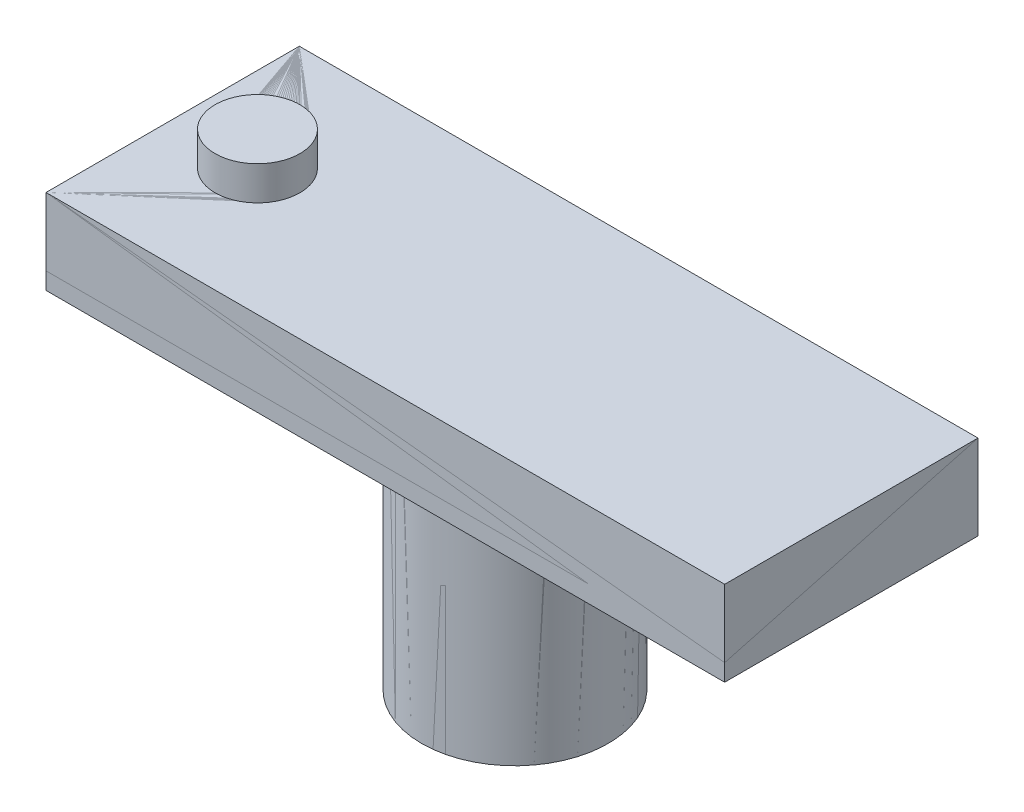
ISO-10303-21;
HEADER;
FILE_DESCRIPTION(('STEP AP214'),'2;1');
FILE_NAME('part.step','',(''),(''),'','','');
FILE_SCHEMA(('AUTOMOTIVE_DESIGN { 1 0 10303 214 1 1 1 1 }'));
ENDSEC;
DATA;
#1=APPLICATION_CONTEXT('core data for automotive mechanical design processes');
#2=APPLICATION_PROTOCOL_DEFINITION('international standard','automotive_design',2000,#1);
#3=PRODUCT_CONTEXT('',#1,'mechanical');
#4=PRODUCT('Part','Part','',(#3));
#5=PRODUCT_RELATED_PRODUCT_CATEGORY('part','',(#4));
#6=PRODUCT_DEFINITION_FORMATION('','',#4);
#7=PRODUCT_DEFINITION_CONTEXT('part definition',#1,'design');
#8=PRODUCT_DEFINITION('design','',#6,#7);
#9=PRODUCT_DEFINITION_SHAPE('','',#8);
#10=(LENGTH_UNIT() NAMED_UNIT(*) SI_UNIT(.MILLI.,.METRE.));
#11=(NAMED_UNIT(*) PLANE_ANGLE_UNIT() SI_UNIT($,.RADIAN.));
#12=(NAMED_UNIT(*) SI_UNIT($,.STERADIAN.) SOLID_ANGLE_UNIT());
#13=UNCERTAINTY_MEASURE_WITH_UNIT(LENGTH_MEASURE(1.E-05),#10,'distance_accuracy_value','');
#14=(GEOMETRIC_REPRESENTATION_CONTEXT(3) GLOBAL_UNCERTAINTY_ASSIGNED_CONTEXT((#13)) GLOBAL_UNIT_ASSIGNED_CONTEXT((#10,
#11,#12)) REPRESENTATION_CONTEXT('',''));
#15=CARTESIAN_POINT('',(0.,0.,0.));
#16=DIRECTION('',(0.,0.,1.));
#17=DIRECTION('',(1.,0.,0.));
#18=AXIS2_PLACEMENT_3D('',#15,#16,#17);
#19=CARTESIAN_POINT('',(0.196069676803745,0.,0.0239463278717267));
#20=DIRECTION('',(0.,1.,0.));
#21=DIRECTION('',(0.,0.,1.));
#22=AXIS2_PLACEMENT_3D('',#19,#20,#21);
#23=PLANE('',#22);
#24=CARTESIAN_POINT('',(0.196069676803745,0.,0.0239463278717267));
#25=DIRECTION('',(0.,1.,0.));
#26=DIRECTION('',(0.,0.,1.));
#27=AXIS2_PLACEMENT_3D('',#24,#25,#26);
#28=CIRCLE('',#27,5.5);
#29=CARTESIAN_POINT('',(0.196069676803745,0.,5.52394632787173));
#30=VERTEX_POINT('',#29);
#31=EDGE_CURVE('E152',#30,#30,#28,.T.);
#32=ORIENTED_EDGE('',*,*,#31,.F.);
#33=EDGE_LOOP('',(#32));
#34=FACE_BOUND('',#33,.T.);
#35=CARTESIAN_POINT('',(0.,0.,0.));
#36=DIRECTION('',(0.,1.,0.));
#37=DIRECTION('',(0.,0.,1.));
#38=AXIS2_PLACEMENT_3D('',#35,#36,#37);
#39=CIRCLE('',#38,4.);
#40=CARTESIAN_POINT('',(0.,0.,4.));
#41=VERTEX_POINT('',#40);
#42=EDGE_CURVE('E148',#41,#41,#39,.T.);
#43=ORIENTED_EDGE('',*,*,#42,.T.);
#44=EDGE_LOOP('',(#43));
#45=FACE_BOUND('',#44,.T.);
#46=ADVANCED_FACE('F51',(#34,#45),#23,.F.);
#47=CARTESIAN_POINT('',(0.196069676803745,15.,0.0239463278717267));
#48=DIRECTION('',(0.,-1.,0.));
#49=DIRECTION('',(0.,0.,-1.));
#50=AXIS2_PLACEMENT_3D('',#47,#48,#49);
#51=CYLINDRICAL_SURFACE('',#50,5.5);
#52=CARTESIAN_POINT('',(0.196069676803745,15.,0.0239463278717267));
#53=DIRECTION('',(0.,1.,0.));
#54=DIRECTION('',(0.,0.,1.));
#55=AXIS2_PLACEMENT_3D('',#52,#53,#54);
#56=CIRCLE('',#55,5.5);
#57=CARTESIAN_POINT('',(0.196069676803745,15.,5.52394632787173));
#58=VERTEX_POINT('',#57);
#59=EDGE_CURVE('E62',#58,#58,#56,.T.);
#60=ORIENTED_EDGE('',*,*,#59,.F.);
#61=EDGE_LOOP('',(#60));
#62=FACE_BOUND('',#61,.T.);
#63=ORIENTED_EDGE('',*,*,#31,.T.);
#64=EDGE_LOOP('',(#63));
#65=FACE_BOUND('',#64,.T.);
#66=ADVANCED_FACE('F53',(#62,#65),#51,.T.);
#67=CARTESIAN_POINT('',(0.,15.,0.));
#68=DIRECTION('',(0.,-1.,0.));
#69=DIRECTION('',(0.,0.,-1.));
#70=AXIS2_PLACEMENT_3D('',#67,#68,#69);
#71=CYLINDRICAL_SURFACE('',#70,4.);
#72=CARTESIAN_POINT('',(0.,15.,0.));
#73=DIRECTION('',(0.,1.,0.));
#74=DIRECTION('',(0.,0.,1.));
#75=AXIS2_PLACEMENT_3D('',#72,#73,#74);
#76=CIRCLE('',#75,4.);
#77=CARTESIAN_POINT('',(0.,15.,4.));
#78=VERTEX_POINT('',#77);
#79=EDGE_CURVE('E144',#78,#78,#76,.T.);
#80=ORIENTED_EDGE('',*,*,#79,.T.);
#81=EDGE_LOOP('',(#80));
#82=FACE_BOUND('',#81,.T.);
#83=ORIENTED_EDGE('',*,*,#42,.F.);
#84=EDGE_LOOP('',(#83));
#85=FACE_BOUND('',#84,.T.);
#86=ADVANCED_FACE('F164',(#82,#85),#71,.F.);
#87=CARTESIAN_POINT('',(0.,15.,0.));
#88=DIRECTION('',(0.,1.,0.));
#89=DIRECTION('',(0.,0.,1.));
#90=AXIS2_PLACEMENT_3D('',#87,#88,#89);
#91=PLANE('',#90);
#92=ORIENTED_EDGE('',*,*,#79,.F.);
#93=EDGE_LOOP('',(#92));
#94=FACE_BOUND('',#93,.T.);
#95=ADVANCED_FACE('F166',(#94),#91,.F.);
#96=CARTESIAN_POINT('',(-20.,19.,-7.46538735620483));
#97=DIRECTION('',(1.,0.,0.));
#98=DIRECTION('',(0.,0.,-1.));
#99=AXIS2_PLACEMENT_3D('',#96,#97,#98);
#100=PLANE('',#99);
#101=DIRECTION('',(0.,0.,1.));
#102=VECTOR('',#101,1.);
#103=CARTESIAN_POINT('',(-20.,15.,-7.46538735620483));
#104=LINE('',#103,#102);
#105=CARTESIAN_POINT('',(-20.,15.,-7.46538735620483));
#106=VERTEX_POINT('',#105);
#107=CARTESIAN_POINT('',(-20.,15.,7.46538735620483));
#108=VERTEX_POINT('',#107);
#109=EDGE_CURVE('E126',#106,#108,#104,.T.);
#110=ORIENTED_EDGE('',*,*,#109,.T.);
#111=DIRECTION('',(0.,-1.,0.));
#112=VECTOR('',#111,1.);
#113=CARTESIAN_POINT('',(-20.,19.,7.46538735620483));
#114=LINE('',#113,#112);
#115=CARTESIAN_POINT('',(-20.,19.,7.46538735620483));
#116=VERTEX_POINT('',#115);
#117=EDGE_CURVE('E116',#116,#108,#114,.T.);
#118=ORIENTED_EDGE('',*,*,#117,.F.);
#119=DIRECTION('',(0.,0.,1.));
#120=VECTOR('',#119,1.);
#121=CARTESIAN_POINT('',(-20.,19.,-7.46538735620483));
#122=LINE('',#121,#120);
#123=CARTESIAN_POINT('',(-20.,19.,-7.46538735620483));
#124=VERTEX_POINT('',#123);
#125=EDGE_CURVE('E105',#124,#116,#122,.T.);
#126=ORIENTED_EDGE('',*,*,#125,.F.);
#127=DIRECTION('',(0.,-1.,0.));
#128=VECTOR('',#127,1.);
#129=CARTESIAN_POINT('',(-20.,19.,-7.46538735620483));
#130=LINE('',#129,#128);
#131=EDGE_CURVE('E71',#124,#106,#130,.T.);
#132=ORIENTED_EDGE('',*,*,#131,.T.);
#133=EDGE_LOOP('',(#110,#118,#126,#132));
#134=FACE_BOUND('',#133,.T.);
#135=ADVANCED_FACE('F173',(#134),#100,.F.);
#136=CARTESIAN_POINT('',(-20.,19.,7.46538735620483));
#137=DIRECTION('',(0.,0.,-1.));
#138=DIRECTION('',(-1.,0.,0.));
#139=AXIS2_PLACEMENT_3D('',#136,#137,#138);
#140=PLANE('',#139);
#141=DIRECTION('',(1.,0.,0.));
#142=VECTOR('',#141,1.);
#143=CARTESIAN_POINT('',(-20.,15.,7.46538735620483));
#144=LINE('',#143,#142);
#145=CARTESIAN_POINT('',(20.,15.,7.46538735620481));
#146=VERTEX_POINT('',#145);
#147=EDGE_CURVE('E112',#108,#146,#144,.T.);
#148=ORIENTED_EDGE('',*,*,#147,.T.);
#149=DIRECTION('',(0.,-1.,0.));
#150=VECTOR('',#149,1.);
#151=CARTESIAN_POINT('',(20.,19.,7.46538735620481));
#152=LINE('',#151,#150);
#153=CARTESIAN_POINT('',(20.,19.,7.46538735620481));
#154=VERTEX_POINT('',#153);
#155=EDGE_CURVE('E110',#154,#146,#152,.T.);
#156=ORIENTED_EDGE('',*,*,#155,.F.);
#157=DIRECTION('',(1.,0.,0.));
#158=VECTOR('',#157,1.);
#159=CARTESIAN_POINT('',(-20.,19.,7.46538735620483));
#160=LINE('',#159,#158);
#161=EDGE_CURVE('E97',#116,#154,#160,.T.);
#162=ORIENTED_EDGE('',*,*,#161,.F.);
#163=ORIENTED_EDGE('',*,*,#117,.T.);
#164=EDGE_LOOP('',(#148,#156,#162,#163));
#165=FACE_BOUND('',#164,.T.);
#166=ADVANCED_FACE('F111',(#165),#140,.F.);
#167=CARTESIAN_POINT('',(20.,19.,-7.46538735620483));
#168=DIRECTION('',(1.,0.,0.));
#169=DIRECTION('',(0.,0.,-1.));
#170=AXIS2_PLACEMENT_3D('',#167,#168,#169);
#171=PLANE('',#170);
#172=DIRECTION('',(0.,0.,1.));
#173=VECTOR('',#172,1.);
#174=CARTESIAN_POINT('',(20.,15.,-7.46538735620483));
#175=LINE('',#174,#173);
#176=CARTESIAN_POINT('',(20.,15.,-7.46538735620483));
#177=VERTEX_POINT('',#176);
#178=EDGE_CURVE('E131',#177,#146,#175,.T.);
#179=ORIENTED_EDGE('',*,*,#178,.F.);
#180=DIRECTION('',(0.,-1.,0.));
#181=VECTOR('',#180,1.);
#182=CARTESIAN_POINT('',(20.,19.,-7.46538735620483));
#183=LINE('',#182,#181);
#184=CARTESIAN_POINT('',(20.,19.,-7.46538735620483));
#185=VERTEX_POINT('',#184);
#186=EDGE_CURVE('E85',#185,#177,#183,.T.);
#187=ORIENTED_EDGE('',*,*,#186,.F.);
#188=DIRECTION('',(0.,0.,1.));
#189=VECTOR('',#188,1.);
#190=CARTESIAN_POINT('',(20.,19.,-7.46538735620483));
#191=LINE('',#190,#189);
#192=EDGE_CURVE('E104',#185,#154,#191,.T.);
#193=ORIENTED_EDGE('',*,*,#192,.T.);
#194=ORIENTED_EDGE('',*,*,#155,.T.);
#195=EDGE_LOOP('',(#179,#187,#193,#194));
#196=FACE_BOUND('',#195,.T.);
#197=ADVANCED_FACE('F118',(#196),#171,.T.);
#198=CARTESIAN_POINT('',(-20.,19.,-7.46538735620483));
#199=DIRECTION('',(0.,0.,-1.));
#200=DIRECTION('',(-1.,0.,0.));
#201=AXIS2_PLACEMENT_3D('',#198,#199,#200);
#202=PLANE('',#201);
#203=DIRECTION('',(1.,0.,0.));
#204=VECTOR('',#203,1.);
#205=CARTESIAN_POINT('',(-20.,15.,-7.46538735620483));
#206=LINE('',#205,#204);
#207=EDGE_CURVE('E134',#106,#177,#206,.T.);
#208=ORIENTED_EDGE('',*,*,#207,.F.);
#209=ORIENTED_EDGE('',*,*,#131,.F.);
#210=DIRECTION('',(1.,0.,0.));
#211=VECTOR('',#210,1.);
#212=CARTESIAN_POINT('',(-20.,19.,-7.46538735620483));
#213=LINE('',#212,#211);
#214=EDGE_CURVE('E120',#124,#185,#213,.T.);
#215=ORIENTED_EDGE('',*,*,#214,.T.);
#216=ORIENTED_EDGE('',*,*,#186,.T.);
#217=EDGE_LOOP('',(#208,#209,#215,#216));
#218=FACE_BOUND('',#217,.T.);
#219=ADVANCED_FACE('F185',(#218),#202,.T.);
#220=CARTESIAN_POINT('',(0.,19.,0.));
#221=DIRECTION('',(0.,1.,0.));
#222=DIRECTION('',(0.,0.,1.));
#223=AXIS2_PLACEMENT_3D('',#220,#221,#222);
#224=PLANE('',#223);
#225=CARTESIAN_POINT('',(-15.,19.,0.));
#226=DIRECTION('',(0.,1.,0.));
#227=DIRECTION('',(0.,0.,1.));
#228=AXIS2_PLACEMENT_3D('',#225,#226,#227);
#229=CIRCLE('',#228,2.5);
#230=CARTESIAN_POINT('',(-15.,19.,2.5));
#231=VERTEX_POINT('',#230);
#232=EDGE_CURVE('E12',#231,#231,#229,.T.);
#233=ORIENTED_EDGE('',*,*,#232,.F.);
#234=EDGE_LOOP('',(#233));
#235=FACE_BOUND('',#234,.T.);
#236=ORIENTED_EDGE('',*,*,#125,.T.);
#237=ORIENTED_EDGE('',*,*,#161,.T.);
#238=ORIENTED_EDGE('',*,*,#192,.F.);
#239=ORIENTED_EDGE('',*,*,#214,.F.);
#240=EDGE_LOOP('',(#236,#237,#238,#239));
#241=FACE_BOUND('',#240,.T.);
#242=ADVANCED_FACE('F101',(#235,#241),#224,.T.);
#243=CARTESIAN_POINT('',(-15.,15.,0.));
#244=DIRECTION('',(0.,1.,0.));
#245=DIRECTION('',(0.,0.,1.));
#246=AXIS2_PLACEMENT_3D('',#243,#244,#245);
#247=CIRCLE('',#246,2.5);
#248=CARTESIAN_POINT('',(-15.,15.,2.5));
#249=VERTEX_POINT('',#248);
#250=EDGE_CURVE('E55',#249,#249,#247,.T.);
#251=ORIENTED_EDGE('',*,*,#250,.T.);
#252=EDGE_LOOP('',(#251));
#253=FACE_BOUND('',#252,.T.);
#254=ORIENTED_EDGE('',*,*,#59,.T.);
#255=EDGE_LOOP('',(#254));
#256=FACE_BOUND('',#255,.T.);
#257=ORIENTED_EDGE('',*,*,#109,.F.);
#258=ORIENTED_EDGE('',*,*,#207,.T.);
#259=ORIENTED_EDGE('',*,*,#178,.T.);
#260=ORIENTED_EDGE('',*,*,#147,.F.);
#261=EDGE_LOOP('',(#257,#258,#259,#260));
#262=FACE_BOUND('',#261,.T.);
#263=ADVANCED_FACE('F176',(#253,#256,#262),#91,.F.);
#264=CARTESIAN_POINT('',(-15.,12.,0.));
#265=DIRECTION('',(0.,1.,0.));
#266=DIRECTION('',(0.,0.,1.));
#267=AXIS2_PLACEMENT_3D('',#264,#265,#266);
#268=PLANE('',#267);
#269=CARTESIAN_POINT('',(-15.,12.,0.));
#270=DIRECTION('',(0.,1.,0.));
#271=DIRECTION('',(0.,0.,1.));
#272=AXIS2_PLACEMENT_3D('',#269,#270,#271);
#273=CIRCLE('',#272,2.5);
#274=CARTESIAN_POINT('',(-15.,12.,2.5));
#275=VERTEX_POINT('',#274);
#276=EDGE_CURVE('E212',#275,#275,#273,.T.);
#277=ORIENTED_EDGE('',*,*,#276,.F.);
#278=EDGE_LOOP('',(#277));
#279=FACE_BOUND('',#278,.T.);
#280=ADVANCED_FACE('F189',(#279),#268,.F.);
#281=CARTESIAN_POINT('',(-15.,12.,0.));
#282=DIRECTION('',(0.,1.,0.));
#283=DIRECTION('',(0.,0.,1.));
#284=AXIS2_PLACEMENT_3D('',#281,#282,#283);
#285=CYLINDRICAL_SURFACE('',#284,2.5);
#286=ORIENTED_EDGE('',*,*,#276,.T.);
#287=EDGE_LOOP('',(#286));
#288=FACE_BOUND('',#287,.T.);
#289=ORIENTED_EDGE('',*,*,#250,.F.);
#290=EDGE_LOOP('',(#289));
#291=FACE_BOUND('',#290,.T.);
#292=ADVANCED_FACE('F198',(#288,#291),#285,.T.);
#293=ORIENTED_EDGE('',*,*,#232,.T.);
#294=EDGE_LOOP('',(#293));
#295=FACE_BOUND('',#294,.T.);
#296=CARTESIAN_POINT('',(-15.,21.,0.));
#297=DIRECTION('',(0.,1.,0.));
#298=DIRECTION('',(0.,0.,1.));
#299=AXIS2_PLACEMENT_3D('',#296,#297,#298);
#300=CIRCLE('',#299,2.5);
#301=CARTESIAN_POINT('',(-15.,21.,2.5));
#302=VERTEX_POINT('',#301);
#303=EDGE_CURVE('E209',#302,#302,#300,.T.);
#304=ORIENTED_EDGE('',*,*,#303,.F.);
#305=EDGE_LOOP('',(#304));
#306=FACE_BOUND('',#305,.T.);
#307=ADVANCED_FACE('F194',(#295,#306),#285,.T.);
#308=CARTESIAN_POINT('',(-15.,21.,0.));
#309=DIRECTION('',(0.,1.,0.));
#310=DIRECTION('',(0.,0.,1.));
#311=AXIS2_PLACEMENT_3D('',#308,#309,#310);
#312=PLANE('',#311);
#313=ORIENTED_EDGE('',*,*,#303,.T.);
#314=EDGE_LOOP('',(#313));
#315=FACE_BOUND('',#314,.T.);
#316=ADVANCED_FACE('F197',(#315),#312,.T.);
#317=CLOSED_SHELL('',(#46,#66,#86,#95,#135,#166,#197,#219,#242,#263,#280,#292,#307,#316));
#318=MANIFOLD_SOLID_BREP('B2',#317);
#319=CARTESIAN_POINT('',(0.196069676803745,0.,0.0239463278717267));
#320=DIRECTION('',(0.,1.,0.));
#321=DIRECTION('',(0.,0.,1.));
#322=AXIS2_PLACEMENT_3D('',#319,#320,#321);
#323=PLANE('',#322);
#324=CARTESIAN_POINT('',(0.196069676803745,0.,0.0239463278717267));
#325=DIRECTION('',(0.,1.,0.));
#326=DIRECTION('',(0.,0.,1.));
#327=AXIS2_PLACEMENT_3D('',#324,#325,#326);
#328=CIRCLE('',#327,5.5);
#329=CARTESIAN_POINT('',(0.196069676803745,0.,5.52394632787173));
#330=VERTEX_POINT('',#329);
#331=EDGE_CURVE('E321',#330,#330,#328,.T.);
#332=ORIENTED_EDGE('',*,*,#331,.F.);
#333=EDGE_LOOP('',(#332));
#334=FACE_BOUND('',#333,.T.);
#335=CARTESIAN_POINT('',(0.,0.,0.));
#336=DIRECTION('',(0.,1.,0.));
#337=DIRECTION('',(0.,0.,1.));
#338=AXIS2_PLACEMENT_3D('',#335,#336,#337);
#339=CIRCLE('',#338,4.);
#340=CARTESIAN_POINT('',(0.,0.,4.));
#341=VERTEX_POINT('',#340);
#342=EDGE_CURVE('E400',#341,#341,#339,.T.);
#343=ORIENTED_EDGE('',*,*,#342,.T.);
#344=EDGE_LOOP('',(#343));
#345=FACE_BOUND('',#344,.T.);
#346=ADVANCED_FACE('F312',(#334,#345),#323,.F.);
#347=CARTESIAN_POINT('',(0.196069676803745,15.,0.0239463278717267));
#348=DIRECTION('',(0.,-1.,0.));
#349=DIRECTION('',(0.,0.,-1.));
#350=AXIS2_PLACEMENT_3D('',#347,#348,#349);
#351=CYLINDRICAL_SURFACE('',#350,5.5);
#352=CARTESIAN_POINT('',(0.196069676803745,14.,0.0239463278717267));
#353=DIRECTION('',(0.,-1.,0.));
#354=DIRECTION('',(0.,0.,-1.));
#355=AXIS2_PLACEMENT_3D('',#352,#353,#354);
#356=CIRCLE('',#355,5.5);
#357=CARTESIAN_POINT('',(0.196069676803745,14.,-5.47605367212827));
#358=VERTEX_POINT('',#357);
#359=EDGE_CURVE('E366',#358,#358,#356,.T.);
#360=ORIENTED_EDGE('',*,*,#359,.T.);
#361=EDGE_LOOP('',(#360));
#362=FACE_BOUND('',#361,.T.);
#363=ORIENTED_EDGE('',*,*,#331,.T.);
#364=EDGE_LOOP('',(#363));
#365=FACE_BOUND('',#364,.T.);
#366=ADVANCED_FACE('F314',(#362,#365),#351,.T.);
#367=CARTESIAN_POINT('',(0.,15.,0.));
#368=DIRECTION('',(0.,-1.,0.));
#369=DIRECTION('',(0.,0.,-1.));
#370=AXIS2_PLACEMENT_3D('',#367,#368,#369);
#371=CYLINDRICAL_SURFACE('',#370,4.);
#372=CARTESIAN_POINT('',(0.,14.,0.));
#373=DIRECTION('',(0.,-1.,0.));
#374=DIRECTION('',(0.,0.,-1.));
#375=AXIS2_PLACEMENT_3D('',#372,#373,#374);
#376=CIRCLE('',#375,4.);
#377=CARTESIAN_POINT('',(0.,14.,-4.));
#378=VERTEX_POINT('',#377);
#379=EDGE_CURVE('E49',#378,#378,#376,.T.);
#380=ORIENTED_EDGE('',*,*,#379,.F.);
#381=EDGE_LOOP('',(#380));
#382=FACE_BOUND('',#381,.T.);
#383=ORIENTED_EDGE('',*,*,#342,.F.);
#384=EDGE_LOOP('',(#383));
#385=FACE_BOUND('',#384,.T.);
#386=ADVANCED_FACE('F434',(#382,#385),#371,.F.);
#387=CARTESIAN_POINT('',(0.,14.,0.));
#388=DIRECTION('',(0.,-1.,0.));
#389=DIRECTION('',(0.,0.,-1.));
#390=AXIS2_PLACEMENT_3D('',#387,#388,#389);
#391=PLANE('',#390);
#392=ORIENTED_EDGE('',*,*,#379,.T.);
#393=EDGE_LOOP('',(#392));
#394=FACE_BOUND('',#393,.T.);
#395=ADVANCED_FACE('F428',(#394),#391,.T.);
#396=CARTESIAN_POINT('',(-20.,14.,-7.46538735620483));
#397=DIRECTION('',(0.,0.,1.));
#398=DIRECTION('',(1.,0.,0.));
#399=AXIS2_PLACEMENT_3D('',#396,#397,#398);
#400=PLANE('',#399);
#401=DIRECTION('',(0.,1.,0.));
#402=VECTOR('',#401,1.);
#403=CARTESIAN_POINT('',(-20.,14.,-7.46538735620483));
#404=LINE('',#403,#402);
#405=CARTESIAN_POINT('',(-20.,14.,-7.46538735620483));
#406=VERTEX_POINT('',#405);
#407=CARTESIAN_POINT('',(-20.,19.,-7.46538735620483));
#408=VERTEX_POINT('',#407);
#409=EDGE_CURVE('E329',#406,#408,#404,.T.);
#410=ORIENTED_EDGE('',*,*,#409,.T.);
#411=DIRECTION('',(1.,0.,0.));
#412=VECTOR('',#411,1.);
#413=CARTESIAN_POINT('',(-20.,19.,-7.46538735620483));
#414=LINE('',#413,#412);
#415=CARTESIAN_POINT('',(20.,19.,-7.46538735620483));
#416=VERTEX_POINT('',#415);
#417=EDGE_CURVE('E374',#408,#416,#414,.T.);
#418=ORIENTED_EDGE('',*,*,#417,.T.);
#419=DIRECTION('',(0.,1.,0.));
#420=VECTOR('',#419,1.);
#421=CARTESIAN_POINT('',(20.,14.,-7.46538735620483));
#422=LINE('',#421,#420);
#423=CARTESIAN_POINT('',(20.,14.,-7.46538735620483));
#424=VERTEX_POINT('',#423);
#425=EDGE_CURVE('E357',#424,#416,#422,.T.);
#426=ORIENTED_EDGE('',*,*,#425,.F.);
#427=DIRECTION('',(1.,0.,0.));
#428=VECTOR('',#427,1.);
#429=CARTESIAN_POINT('',(-20.,14.,-7.46538735620483));
#430=LINE('',#429,#428);
#431=EDGE_CURVE('E388',#406,#424,#430,.T.);
#432=ORIENTED_EDGE('',*,*,#431,.F.);
#433=EDGE_LOOP('',(#410,#418,#426,#432));
#434=FACE_BOUND('',#433,.T.);
#435=ADVANCED_FACE('F377',(#434),#400,.F.);
#436=CARTESIAN_POINT('',(20.,14.,-7.46538735620483));
#437=DIRECTION('',(-1.,0.,0.));
#438=DIRECTION('',(0.,0.,1.));
#439=AXIS2_PLACEMENT_3D('',#436,#437,#438);
#440=PLANE('',#439);
#441=ORIENTED_EDGE('',*,*,#425,.T.);
#442=DIRECTION('',(0.,0.,1.));
#443=VECTOR('',#442,1.);
#444=CARTESIAN_POINT('',(20.,19.,-7.46538735620483));
#445=LINE('',#444,#443);
#446=CARTESIAN_POINT('',(20.,19.,7.46538735620481));
#447=VERTEX_POINT('',#446);
#448=EDGE_CURVE('E361',#416,#447,#445,.T.);
#449=ORIENTED_EDGE('',*,*,#448,.T.);
#450=DIRECTION('',(0.,1.,0.));
#451=VECTOR('',#450,1.);
#452=CARTESIAN_POINT('',(20.,14.,7.46538735620481));
#453=LINE('',#452,#451);
#454=CARTESIAN_POINT('',(20.,14.,7.46538735620481));
#455=VERTEX_POINT('',#454);
#456=EDGE_CURVE('E367',#455,#447,#453,.T.);
#457=ORIENTED_EDGE('',*,*,#456,.F.);
#458=DIRECTION('',(0.,0.,1.));
#459=VECTOR('',#458,1.);
#460=CARTESIAN_POINT('',(20.,14.,-7.46538735620483));
#461=LINE('',#460,#459);
#462=EDGE_CURVE('E362',#424,#455,#461,.T.);
#463=ORIENTED_EDGE('',*,*,#462,.F.);
#464=EDGE_LOOP('',(#441,#449,#457,#463));
#465=FACE_BOUND('',#464,.T.);
#466=ADVANCED_FACE('F359',(#465),#440,.F.);
#467=CARTESIAN_POINT('',(-20.,14.,7.46538735620483));
#468=DIRECTION('',(0.,0.,1.));
#469=DIRECTION('',(1.,0.,0.));
#470=AXIS2_PLACEMENT_3D('',#467,#468,#469);
#471=PLANE('',#470);
#472=ORIENTED_EDGE('',*,*,#456,.T.);
#473=DIRECTION('',(1.,0.,0.));
#474=VECTOR('',#473,1.);
#475=CARTESIAN_POINT('',(-20.,19.,7.46538735620483));
#476=LINE('',#475,#474);
#477=CARTESIAN_POINT('',(-20.,19.,7.46538735620483));
#478=VERTEX_POINT('',#477);
#479=EDGE_CURVE('E375',#478,#447,#476,.T.);
#480=ORIENTED_EDGE('',*,*,#479,.F.);
#481=DIRECTION('',(0.,1.,0.));
#482=VECTOR('',#481,1.);
#483=CARTESIAN_POINT('',(-20.,14.,7.46538735620483));
#484=LINE('',#483,#482);
#485=CARTESIAN_POINT('',(-20.,14.,7.46538735620483));
#486=VERTEX_POINT('',#485);
#487=EDGE_CURVE('E337',#486,#478,#484,.T.);
#488=ORIENTED_EDGE('',*,*,#487,.F.);
#489=DIRECTION('',(1.,0.,0.));
#490=VECTOR('',#489,1.);
#491=CARTESIAN_POINT('',(-20.,14.,7.46538735620483));
#492=LINE('',#491,#490);
#493=EDGE_CURVE('E391',#486,#455,#492,.T.);
#494=ORIENTED_EDGE('',*,*,#493,.T.);
#495=EDGE_LOOP('',(#472,#480,#488,#494));
#496=FACE_BOUND('',#495,.T.);
#497=ADVANCED_FACE('F446',(#496),#471,.T.);
#498=CARTESIAN_POINT('',(-20.,14.,-7.46538735620483));
#499=DIRECTION('',(-1.,0.,0.));
#500=DIRECTION('',(0.,0.,1.));
#501=AXIS2_PLACEMENT_3D('',#498,#499,#500);
#502=PLANE('',#501);
#503=ORIENTED_EDGE('',*,*,#487,.T.);
#504=DIRECTION('',(0.,0.,1.));
#505=VECTOR('',#504,1.);
#506=CARTESIAN_POINT('',(-20.,19.,-7.46538735620483));
#507=LINE('',#506,#505);
#508=EDGE_CURVE('E386',#408,#478,#507,.T.);
#509=ORIENTED_EDGE('',*,*,#508,.F.);
#510=ORIENTED_EDGE('',*,*,#409,.F.);
#511=DIRECTION('',(0.,0.,1.));
#512=VECTOR('',#511,1.);
#513=CARTESIAN_POINT('',(-20.,14.,-7.46538735620483));
#514=LINE('',#513,#512);
#515=EDGE_CURVE('E393',#406,#486,#514,.T.);
#516=ORIENTED_EDGE('',*,*,#515,.T.);
#517=EDGE_LOOP('',(#503,#509,#510,#516));
#518=FACE_BOUND('',#517,.T.);
#519=ADVANCED_FACE('F426',(#518),#502,.T.);
#520=CARTESIAN_POINT('',(-15.,14.,0.));
#521=DIRECTION('',(0.,-1.,0.));
#522=DIRECTION('',(0.,0.,-1.));
#523=AXIS2_PLACEMENT_3D('',#520,#521,#522);
#524=CIRCLE('',#523,2.5);
#525=CARTESIAN_POINT('',(-15.,14.,-2.5));
#526=VERTEX_POINT('',#525);
#527=EDGE_CURVE('E405',#526,#526,#524,.F.);
#528=ORIENTED_EDGE('',*,*,#527,.T.);
#529=EDGE_LOOP('',(#528));
#530=FACE_BOUND('',#529,.T.);
#531=CARTESIAN_POINT('',(15.,14.,0.));
#532=DIRECTION('',(0.,-1.,0.));
#533=DIRECTION('',(0.,0.,-1.));
#534=AXIS2_PLACEMENT_3D('',#531,#532,#533);
#535=CIRCLE('',#534,2.5);
#536=CARTESIAN_POINT('',(15.,14.,-2.5));
#537=VERTEX_POINT('',#536);
#538=EDGE_CURVE('E378',#537,#537,#535,.T.);
#539=ORIENTED_EDGE('',*,*,#538,.F.);
#540=EDGE_LOOP('',(#539));
#541=FACE_BOUND('',#540,.T.);
#542=ORIENTED_EDGE('',*,*,#359,.F.);
#543=EDGE_LOOP('',(#542));
#544=FACE_BOUND('',#543,.T.);
#545=ORIENTED_EDGE('',*,*,#431,.T.);
#546=ORIENTED_EDGE('',*,*,#462,.T.);
#547=ORIENTED_EDGE('',*,*,#493,.F.);
#548=ORIENTED_EDGE('',*,*,#515,.F.);
#549=EDGE_LOOP('',(#545,#546,#547,#548));
#550=FACE_BOUND('',#549,.T.);
#551=ADVANCED_FACE('F418',(#530,#541,#544,#550),#391,.T.);
#552=CARTESIAN_POINT('',(0.,19.,0.));
#553=DIRECTION('',(0.,-1.,0.));
#554=DIRECTION('',(0.,0.,-1.));
#555=AXIS2_PLACEMENT_3D('',#552,#553,#554);
#556=PLANE('',#555);
#557=CARTESIAN_POINT('',(-15.,19.,0.));
#558=DIRECTION('',(0.,-1.,0.));
#559=DIRECTION('',(0.,0.,-1.));
#560=AXIS2_PLACEMENT_3D('',#557,#558,#559);
#561=CIRCLE('',#560,2.5);
#562=CARTESIAN_POINT('',(-15.,19.,-2.5));
#563=VERTEX_POINT('',#562);
#564=EDGE_CURVE('E316',#563,#563,#561,.F.);
#565=ORIENTED_EDGE('',*,*,#564,.F.);
#566=EDGE_LOOP('',(#565));
#567=FACE_BOUND('',#566,.T.);
#568=CARTESIAN_POINT('',(15.,19.,0.));
#569=DIRECTION('',(0.,-1.,0.));
#570=DIRECTION('',(0.,0.,-1.));
#571=AXIS2_PLACEMENT_3D('',#568,#569,#570);
#572=CIRCLE('',#571,2.5);
#573=CARTESIAN_POINT('',(15.,19.,-2.5));
#574=VERTEX_POINT('',#573);
#575=EDGE_CURVE('E381',#574,#574,#572,.T.);
#576=ORIENTED_EDGE('',*,*,#575,.T.);
#577=EDGE_LOOP('',(#576));
#578=FACE_BOUND('',#577,.T.);
#579=ORIENTED_EDGE('',*,*,#417,.F.);
#580=ORIENTED_EDGE('',*,*,#508,.T.);
#581=ORIENTED_EDGE('',*,*,#479,.T.);
#582=ORIENTED_EDGE('',*,*,#448,.F.);
#583=EDGE_LOOP('',(#579,#580,#581,#582));
#584=FACE_BOUND('',#583,.T.);
#585=ADVANCED_FACE('F372',(#567,#578,#584),#556,.F.);
#586=CARTESIAN_POINT('',(15.,5.,0.));
#587=DIRECTION('',(0.,1.,0.));
#588=DIRECTION('',(0.,0.,1.));
#589=AXIS2_PLACEMENT_3D('',#586,#587,#588);
#590=CYLINDRICAL_SURFACE('',#589,2.5);
#591=ORIENTED_EDGE('',*,*,#538,.T.);
#592=EDGE_LOOP('',(#591));
#593=FACE_BOUND('',#592,.T.);
#594=ORIENTED_EDGE('',*,*,#575,.F.);
#595=EDGE_LOOP('',(#594));
#596=FACE_BOUND('',#595,.T.);
#597=ADVANCED_FACE('F417',(#593,#596),#590,.F.);
#598=CARTESIAN_POINT('',(-15.,29.,0.));
#599=DIRECTION('',(0.,-1.,0.));
#600=DIRECTION('',(0.,0.,-1.));
#601=AXIS2_PLACEMENT_3D('',#598,#599,#600);
#602=CYLINDRICAL_SURFACE('',#601,2.5);
#603=ORIENTED_EDGE('',*,*,#527,.F.);
#604=EDGE_LOOP('',(#603));
#605=FACE_BOUND('',#604,.T.);
#606=ORIENTED_EDGE('',*,*,#564,.T.);
#607=EDGE_LOOP('',(#606));
#608=FACE_BOUND('',#607,.T.);
#609=ADVANCED_FACE('F414',(#605,#608),#602,.F.);
#610=CLOSED_SHELL('',(#346,#366,#386,#395,#435,#466,#497,#519,#551,#585,#597,#609));
#611=MANIFOLD_SOLID_BREP('B6_NOT_SHOWN',#610);
#612=ADVANCED_BREP_SHAPE_REPRESENTATION('',(#18,#318,#611),#14);
#613=SHAPE_DEFINITION_REPRESENTATION(#9,#612);
ENDSEC;
END-ISO-10303-21;
